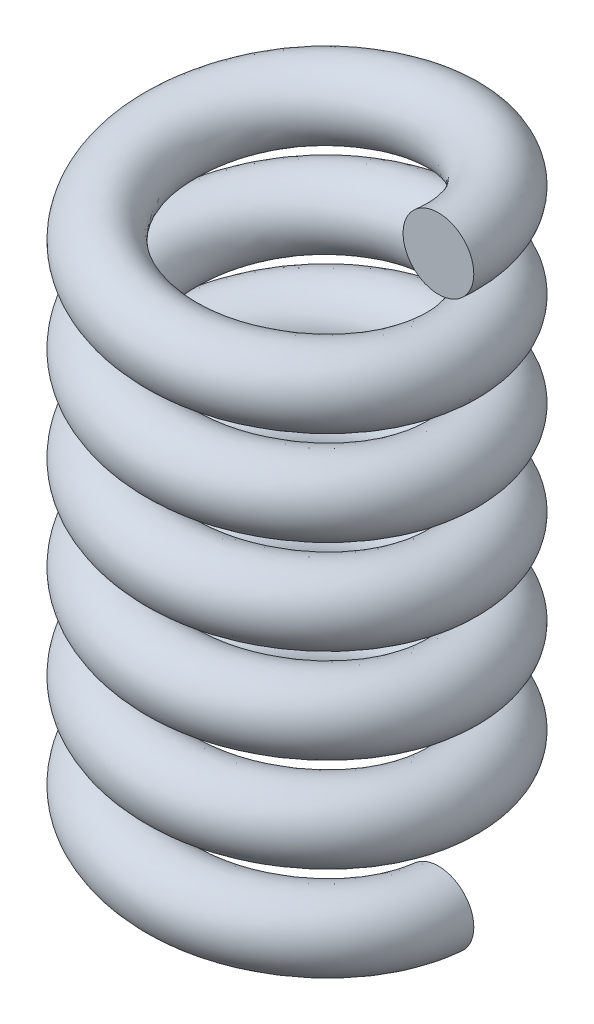
ISO-10303-21;
HEADER;
FILE_DESCRIPTION(('STEP AP214'),'2;1');
FILE_NAME('part.step','',(''),(''),'','','');
FILE_SCHEMA(('AUTOMOTIVE_DESIGN { 1 0 10303 214 1 1 1 1 }'));
ENDSEC;
DATA;
#1=APPLICATION_CONTEXT('core data for automotive mechanical design processes');
#2=APPLICATION_PROTOCOL_DEFINITION('international standard','automotive_design',2000,#1);
#3=PRODUCT_CONTEXT('',#1,'mechanical');
#4=PRODUCT('Part','Part','',(#3));
#5=PRODUCT_RELATED_PRODUCT_CATEGORY('part','',(#4));
#6=PRODUCT_DEFINITION_FORMATION('','',#4);
#7=PRODUCT_DEFINITION_CONTEXT('part definition',#1,'design');
#8=PRODUCT_DEFINITION('design','',#6,#7);
#9=PRODUCT_DEFINITION_SHAPE('','',#8);
#10=(LENGTH_UNIT() NAMED_UNIT(*) SI_UNIT(.MILLI.,.METRE.));
#11=(NAMED_UNIT(*) PLANE_ANGLE_UNIT() SI_UNIT($,.RADIAN.));
#12=(NAMED_UNIT(*) SI_UNIT($,.STERADIAN.) SOLID_ANGLE_UNIT());
#13=UNCERTAINTY_MEASURE_WITH_UNIT(LENGTH_MEASURE(1.E-05),#10,'distance_accuracy_value','');
#14=(GEOMETRIC_REPRESENTATION_CONTEXT(3) GLOBAL_UNCERTAINTY_ASSIGNED_CONTEXT((#13)) GLOBAL_UNIT_ASSIGNED_CONTEXT((#10,
#11,#12)) REPRESENTATION_CONTEXT('',''));
#15=CARTESIAN_POINT('',(0.,0.,0.));
#16=DIRECTION('',(0.,0.,1.));
#17=DIRECTION('',(1.,0.,0.));
#18=AXIS2_PLACEMENT_3D('',#15,#16,#17);
#19=CARTESIAN_POINT('',(10.,0.,8.37955521322352E-13));
#20=DIRECTION('',(0.,0.,1.));
#21=DIRECTION('',(1.,0.,0.));
#22=AXIS2_PLACEMENT_3D('',#19,#20,#21);
#23=PLANE('',#22);
#24=CARTESIAN_POINT('',(10.,0.,8.37955521322352E-13));
#25=DIRECTION('',(0.,0.,1.));
#26=DIRECTION('',(1.,0.,0.));
#27=AXIS2_PLACEMENT_3D('',#24,#25,#26);
#28=CIRCLE('',#27,2.5);
#29=CARTESIAN_POINT('',(12.5,0.,1.04744440165294E-12));
#30=VERTEX_POINT('',#29);
#31=EDGE_CURVE('E45',#30,#30,#28,.T.);
#32=ORIENTED_EDGE('',*,*,#31,.T.);
#33=EDGE_LOOP('',(#32));
#34=FACE_BOUND('',#33,.T.);
#35=ADVANCED_FACE('F39',(#34),#23,.T.);
#36=CARTESIAN_POINT('',(10.,-40.,0.));
#37=DIRECTION('',(0.,0.,1.));
#38=DIRECTION('',(1.,0.,0.));
#39=AXIS2_PLACEMENT_3D('',#36,#37,#38);
#40=PLANE('',#39);
#41=CARTESIAN_POINT('',(10.,-40.,0.));
#42=DIRECTION('',(0.,0.,1.));
#43=DIRECTION('',(1.,0.,0.));
#44=AXIS2_PLACEMENT_3D('',#41,#42,#43);
#45=CIRCLE('',#44,2.5);
#46=CARTESIAN_POINT('',(12.5,-40.,0.));
#47=VERTEX_POINT('',#46);
#48=EDGE_CURVE('E10',#47,#47,#45,.T.);
#49=ORIENTED_EDGE('',*,*,#48,.F.);
#50=EDGE_LOOP('',(#49));
#51=FACE_BOUND('',#50,.T.);
#52=ADVANCED_FACE('F54',(#51),#40,.F.);
#53=CARTESIAN_POINT('',(12.5,0.,1.04744440165294E-12));
#54=CARTESIAN_POINT('',(12.5000000000006,-0.555555555555554,-7.21687836486927));
#55=CARTESIAN_POINT('',(6.25000000000091,-1.11111111111111,-10.825317547305));
#56=CARTESIAN_POINT('',(1.21057253500978E-12,-1.66666666666666,-14.4337567297406));
#57=CARTESIAN_POINT('',(-6.24999999999909,-2.22222222222222,-10.825317547306));
#58=CARTESIAN_POINT('',(-12.4999999999994,-2.77777777777778,-7.21687836487137));
#59=CARTESIAN_POINT('',(-12.5,-3.33333333333333,-1.04897521015187E-12));
#60=CARTESIAN_POINT('',(-12.5000000000006,-3.88888888888888,7.21687836486927));
#61=CARTESIAN_POINT('',(-6.25000000000091,-4.44444444444444,10.825317547305));
#62=CARTESIAN_POINT('',(-1.21152372920822E-12,-4.99999999999999,14.4337567297406));
#63=CARTESIAN_POINT('',(6.24999999999909,-5.55555555555554,10.825317547306));
#64=CARTESIAN_POINT('',(12.4999999999994,-6.1111111111111,7.21687836487138));
#65=CARTESIAN_POINT('',(12.5,-6.66666666666665,1.04744440165294E-12));
#66=CARTESIAN_POINT('',(12.5000000000006,-7.22222222222221,-7.21687836486927));
#67=CARTESIAN_POINT('',(6.25000000000091,-7.77777777777776,-10.825317547305));
#68=CARTESIAN_POINT('',(1.21138896620921E-12,-8.33333333333332,-14.4337567297406));
#69=CARTESIAN_POINT('',(-6.24999999999909,-8.88888888888887,-10.825317547306));
#70=CARTESIAN_POINT('',(-12.4999999999994,-9.44444444444443,-7.21687836487137));
#71=CARTESIAN_POINT('',(-12.5,-9.99999999999998,-1.04897521015187E-12));
#72=CARTESIAN_POINT('',(-12.5000000000006,-10.5555555555555,7.21687836486927));
#73=CARTESIAN_POINT('',(-6.25000000000091,-11.1111111111111,10.825317547305));
#74=CARTESIAN_POINT('',(-1.21070729800879E-12,-11.6666666666666,14.4337567297406));
#75=CARTESIAN_POINT('',(6.24999999999909,-12.2222222222222,10.825317547306));
#76=CARTESIAN_POINT('',(12.4999999999994,-12.7777777777777,7.21687836487138));
#77=CARTESIAN_POINT('',(12.5,-13.3333333333333,1.04744440165294E-12));
#78=CARTESIAN_POINT('',(12.5000000000006,-13.8888888888889,-7.21687836486927));
#79=CARTESIAN_POINT('',(6.25000000000091,-14.4444444444444,-10.825317547305));
#80=CARTESIAN_POINT('',(1.21220539740864E-12,-15.,-14.4337567297406));
#81=CARTESIAN_POINT('',(-6.24999999999909,-15.5555555555555,-10.825317547306));
#82=CARTESIAN_POINT('',(-12.4999999999994,-16.1111111111111,-7.21687836487137));
#83=CARTESIAN_POINT('',(-12.5,-16.6666666666666,-1.04897521015187E-12));
#84=CARTESIAN_POINT('',(-12.5000000000006,-17.2222222222222,7.21687836486927));
#85=CARTESIAN_POINT('',(-6.25000000000091,-17.7777777777777,10.825317547305));
#86=CARTESIAN_POINT('',(-1.20989086680936E-12,-18.3333333333333,14.4337567297406));
#87=CARTESIAN_POINT('',(6.24999999999909,-18.8888888888888,10.825317547306));
#88=CARTESIAN_POINT('',(12.4999999999994,-19.4444444444444,7.21687836487138));
#89=CARTESIAN_POINT('',(12.5,-20.,1.04744440165294E-12));
#90=CARTESIAN_POINT('',(12.5000000000006,-20.5555555555555,-7.21687836486927));
#91=CARTESIAN_POINT('',(6.25000000000091,-21.1111111111111,-10.825317547305));
#92=CARTESIAN_POINT('',(1.21302182860807E-12,-21.6666666666666,-14.4337567297406));
#93=CARTESIAN_POINT('',(-6.24999999999909,-22.2222222222222,-10.825317547306));
#94=CARTESIAN_POINT('',(-12.4999999999994,-22.7777777777777,-7.21687836487137));
#95=CARTESIAN_POINT('',(-12.5,-23.3333333333333,-1.04897521015187E-12));
#96=CARTESIAN_POINT('',(-12.5000000000006,-23.8888888888888,7.21687836486927));
#97=CARTESIAN_POINT('',(-6.25000000000091,-24.4444444444444,10.825317547305));
#98=CARTESIAN_POINT('',(-1.20907443560993E-12,-24.9999999999999,14.4337567297406));
#99=CARTESIAN_POINT('',(6.24999999999909,-25.5555555555555,10.825317547306));
#100=CARTESIAN_POINT('',(12.4999999999994,-26.1111111111111,7.21687836487138));
#101=CARTESIAN_POINT('',(12.5,-26.6666666666666,1.04744440165294E-12));
#102=CARTESIAN_POINT('',(12.5000000000006,-27.2222222222222,-7.21687836486927));
#103=CARTESIAN_POINT('',(6.25000000000091,-27.7777777777777,-10.825317547305));
#104=CARTESIAN_POINT('',(1.2138382598075E-12,-28.3333333333333,-14.4337567297406));
#105=CARTESIAN_POINT('',(-6.24999999999909,-28.8888888888888,-10.825317547306));
#106=CARTESIAN_POINT('',(-12.4999999999994,-29.4444444444444,-7.21687836487137));
#107=CARTESIAN_POINT('',(-12.5,-29.9999999999999,-1.04897521015187E-12));
#108=CARTESIAN_POINT('',(-12.5000000000006,-30.5555555555555,7.21687836486927));
#109=CARTESIAN_POINT('',(-6.25000000000091,-31.111111111111,10.825317547305));
#110=CARTESIAN_POINT('',(-1.2082580044105E-12,-31.6666666666666,14.4337567297406));
#111=CARTESIAN_POINT('',(6.24999999999909,-32.2222222222222,10.825317547306));
#112=CARTESIAN_POINT('',(12.4999999999994,-32.7777777777777,7.21687836487138));
#113=CARTESIAN_POINT('',(12.5,-33.3333333333333,1.04744440165294E-12));
#114=CARTESIAN_POINT('',(12.5000000000006,-33.8888888888888,-7.21687836486927));
#115=CARTESIAN_POINT('',(6.25000000000091,-34.4444444444444,-10.825317547305));
#116=CARTESIAN_POINT('',(1.21465469100694E-12,-34.9999999999999,-14.4337567297406));
#117=CARTESIAN_POINT('',(-6.24999999999909,-35.5555555555555,-10.825317547306));
#118=CARTESIAN_POINT('',(-12.4999999999994,-36.111111111111,-7.21687836487137));
#119=CARTESIAN_POINT('',(-12.5,-36.6666666666666,-1.04897521015187E-12));
#120=CARTESIAN_POINT('',(-12.5000000000006,-37.2222222222221,7.21687836486927));
#121=CARTESIAN_POINT('',(-6.25000000000091,-37.7777777777777,10.825317547305));
#122=CARTESIAN_POINT('',(-1.20744157321106E-12,-38.3333333333333,14.4337567297406));
#123=CARTESIAN_POINT('',(6.24999999999909,-38.8888888888888,10.825317547306));
#124=CARTESIAN_POINT('',(12.4999999999994,-39.4444444444444,7.21687836487138));
#125=CARTESIAN_POINT('',(12.5,-39.9999999999999,1.04744440165294E-12));
#126=CARTESIAN_POINT('',(12.5,5.,1.04744440165294E-12));
#127=CARTESIAN_POINT('',(12.5000000000006,4.44444444444445,-7.21687836486927));
#128=CARTESIAN_POINT('',(6.25000000000091,3.88888888888889,-10.825317547305));
#129=CARTESIAN_POINT('',(1.2099602116102E-12,3.33333333333334,-14.4337567297406));
#130=CARTESIAN_POINT('',(-6.24999999999909,2.77777777777778,-10.825317547306));
#131=CARTESIAN_POINT('',(-12.4999999999994,2.22222222222223,-7.21687836487137));
#132=CARTESIAN_POINT('',(-12.5,1.66666666666667,-1.04897521015187E-12));
#133=CARTESIAN_POINT('',(-12.5000000000006,1.11111111111112,7.21687836486927));
#134=CARTESIAN_POINT('',(-6.25000000000091,0.555555555555563,10.825317547305));
#135=CARTESIAN_POINT('',(-1.2121360526078E-12,0.,14.4337567297406));
#136=CARTESIAN_POINT('',(6.24999999999908,-0.555555555555543,10.825317547306));
#137=CARTESIAN_POINT('',(12.4999999999994,-1.1111111111111,7.21687836487138));
#138=CARTESIAN_POINT('',(12.5,-1.66666666666665,1.04744440165294E-12));
#139=CARTESIAN_POINT('',(12.5000000000006,-2.22222222222221,-7.21687836486927));
#140=CARTESIAN_POINT('',(6.25000000000091,-2.77777777777776,-10.825317547305));
#141=CARTESIAN_POINT('',(1.21077664280964E-12,-3.33333333333332,-14.4337567297406));
#142=CARTESIAN_POINT('',(-6.24999999999909,-3.88888888888887,-10.825317547306));
#143=CARTESIAN_POINT('',(-12.4999999999994,-4.44444444444443,-7.21687836487137));
#144=CARTESIAN_POINT('',(-12.5,-4.99999999999998,-1.04897521015187E-12));
#145=CARTESIAN_POINT('',(-12.5000000000006,-5.55555555555554,7.21687836486927));
#146=CARTESIAN_POINT('',(-6.25000000000091,-6.11111111111109,10.825317547305));
#147=CARTESIAN_POINT('',(-1.21131962140836E-12,-6.66666666666664,14.4337567297406));
#148=CARTESIAN_POINT('',(6.24999999999909,-7.2222222222222,10.825317547306));
#149=CARTESIAN_POINT('',(12.4999999999994,-7.77777777777775,7.21687836487138));
#150=CARTESIAN_POINT('',(12.5,-8.3333333333333,1.04744440165294E-12));
#151=CARTESIAN_POINT('',(12.5000000000006,-8.88888888888886,-7.21687836486927));
#152=CARTESIAN_POINT('',(6.25000000000091,-9.44444444444441,-10.825317547305));
#153=CARTESIAN_POINT('',(1.21159307400907E-12,-9.99999999999997,-14.4337567297406));
#154=CARTESIAN_POINT('',(-6.24999999999909,-10.5555555555555,-10.825317547306));
#155=CARTESIAN_POINT('',(-12.4999999999994,-11.1111111111111,-7.21687836487137));
#156=CARTESIAN_POINT('',(-12.5,-11.6666666666666,-1.04897521015187E-12));
#157=CARTESIAN_POINT('',(-12.5000000000006,-12.2222222222222,7.21687836486927));
#158=CARTESIAN_POINT('',(-6.25000000000091,-12.7777777777777,10.825317547305));
#159=CARTESIAN_POINT('',(-1.21050319020893E-12,-13.3333333333333,14.4337567297406));
#160=CARTESIAN_POINT('',(6.24999999999909,-13.8888888888888,10.825317547306));
#161=CARTESIAN_POINT('',(12.4999999999994,-14.4444444444444,7.21687836487138));
#162=CARTESIAN_POINT('',(12.5,-15.,1.04744440165294E-12));
#163=CARTESIAN_POINT('',(12.5000000000006,-15.5555555555555,-7.21687836486927));
#164=CARTESIAN_POINT('',(6.25000000000091,-16.1111111111111,-10.825317547305));
#165=CARTESIAN_POINT('',(1.2124095052085E-12,-16.6666666666666,-14.4337567297406));
#166=CARTESIAN_POINT('',(-6.24999999999909,-17.2222222222222,-10.825317547306));
#167=CARTESIAN_POINT('',(-12.4999999999994,-17.7777777777777,-7.21687836487137));
#168=CARTESIAN_POINT('',(-12.5,-18.3333333333333,-1.04897521015187E-12));
#169=CARTESIAN_POINT('',(-12.5000000000006,-18.8888888888888,7.21687836486927));
#170=CARTESIAN_POINT('',(-6.25000000000091,-19.4444444444444,10.825317547305));
#171=CARTESIAN_POINT('',(-1.2096867590095E-12,-20.,14.4337567297406));
#172=CARTESIAN_POINT('',(6.24999999999909,-20.5555555555555,10.825317547306));
#173=CARTESIAN_POINT('',(12.4999999999994,-21.1111111111111,7.21687836487138));
#174=CARTESIAN_POINT('',(12.5,-21.6666666666666,1.04744440165294E-12));
#175=CARTESIAN_POINT('',(12.5000000000006,-22.2222222222222,-7.21687836486927));
#176=CARTESIAN_POINT('',(6.25000000000091,-22.7777777777777,-10.825317547305));
#177=CARTESIAN_POINT('',(1.21322593640793E-12,-23.3333333333333,-14.4337567297406));
#178=CARTESIAN_POINT('',(-6.24999999999909,-23.8888888888888,-10.825317547306));
#179=CARTESIAN_POINT('',(-12.4999999999994,-24.4444444444444,-7.21687836487137));
#180=CARTESIAN_POINT('',(-12.5,-24.9999999999999,-1.04897521015187E-12));
#181=CARTESIAN_POINT('',(-12.5000000000006,-25.5555555555555,7.21687836486927));
#182=CARTESIAN_POINT('',(-6.25000000000091,-26.1111111111111,10.825317547305));
#183=CARTESIAN_POINT('',(-1.20887032781007E-12,-26.6666666666666,14.4337567297406));
#184=CARTESIAN_POINT('',(6.24999999999909,-27.2222222222222,10.825317547306));
#185=CARTESIAN_POINT('',(12.4999999999994,-27.7777777777777,7.21687836487138));
#186=CARTESIAN_POINT('',(12.5,-28.3333333333333,1.04744440165294E-12));
#187=CARTESIAN_POINT('',(12.5000000000006,-28.8888888888888,-7.21687836486927));
#188=CARTESIAN_POINT('',(6.25000000000091,-29.4444444444444,-10.825317547305));
#189=CARTESIAN_POINT('',(1.21404236760736E-12,-29.9999999999999,-14.4337567297406));
#190=CARTESIAN_POINT('',(-6.24999999999909,-30.5555555555555,-10.825317547306));
#191=CARTESIAN_POINT('',(-12.4999999999994,-31.111111111111,-7.21687836487137));
#192=CARTESIAN_POINT('',(-12.5,-31.6666666666666,-1.04897521015187E-12));
#193=CARTESIAN_POINT('',(-12.5000000000006,-32.2222222222221,7.21687836486927));
#194=CARTESIAN_POINT('',(-6.25000000000091,-32.7777777777777,10.825317547305));
#195=CARTESIAN_POINT('',(-1.20805389661064E-12,-33.3333333333333,14.4337567297406));
#196=CARTESIAN_POINT('',(6.24999999999909,-33.8888888888888,10.825317547306));
#197=CARTESIAN_POINT('',(12.4999999999994,-34.4444444444444,7.21687836487138));
#198=CARTESIAN_POINT('',(12.5,-34.9999999999999,1.04744440165294E-12));
#199=CARTESIAN_POINT('',(7.5,5.,6.28466640991764E-13));
#200=CARTESIAN_POINT('',(7.50000000000036,4.44444444444445,-4.33012701892156));
#201=CARTESIAN_POINT('',(3.75000000000055,3.88888888888889,-6.49519052838298));
#202=CARTESIAN_POINT('',(7.25812840726236E-13,3.33333333333334,-8.66025403784439));
#203=CARTESIAN_POINT('',(-3.74999999999945,2.77777777777778,-6.49519052838361));
#204=CARTESIAN_POINT('',(-7.49999999999964,2.22222222222223,-4.33012701892283));
#205=CARTESIAN_POINT('',(-7.5,1.66666666666667,-6.29385126091125E-13));
#206=CARTESIAN_POINT('',(-7.50000000000037,1.11111111111112,4.33012701892156));
#207=CARTESIAN_POINT('',(-3.75000000000055,0.555555555555564,6.49519052838298));
#208=CARTESIAN_POINT('',(-7.27281631564677E-13,0.,8.66025403784439));
#209=CARTESIAN_POINT('',(3.74999999999945,-0.555555555555543,6.49519052838361));
#210=CARTESIAN_POINT('',(7.49999999999964,-1.1111111111111,4.33012701892283));
#211=CARTESIAN_POINT('',(7.5,-1.66666666666665,6.28466640991764E-13));
#212=CARTESIAN_POINT('',(7.50000000000036,-2.22222222222221,-4.33012701892156));
#213=CARTESIAN_POINT('',(3.75000000000055,-2.77777777777776,-6.49519052838298));
#214=CARTESIAN_POINT('',(7.26629271925668E-13,-3.33333333333332,-8.66025403784439));
#215=CARTESIAN_POINT('',(-3.74999999999945,-3.88888888888887,-6.49519052838361));
#216=CARTESIAN_POINT('',(-7.49999999999964,-4.44444444444442,-4.33012701892283));
#217=CARTESIAN_POINT('',(-7.5,-4.99999999999998,-6.29385126091125E-13));
#218=CARTESIAN_POINT('',(-7.50000000000037,-5.55555555555553,4.33012701892156));
#219=CARTESIAN_POINT('',(-3.75000000000055,-6.11111111111109,6.49519052838298));
#220=CARTESIAN_POINT('',(-7.26465200365246E-13,-6.66666666666664,8.66025403784439));
#221=CARTESIAN_POINT('',(3.74999999999945,-7.2222222222222,6.49519052838361));
#222=CARTESIAN_POINT('',(7.49999999999964,-7.77777777777775,4.33012701892283));
#223=CARTESIAN_POINT('',(7.5,-8.3333333333333,6.28466640991764E-13));
#224=CARTESIAN_POINT('',(7.50000000000037,-8.88888888888886,-4.33012701892156));
#225=CARTESIAN_POINT('',(3.75000000000055,-9.44444444444441,-6.49519052838298));
#226=CARTESIAN_POINT('',(7.27445703125099E-13,-9.99999999999997,-8.66025403784439));
#227=CARTESIAN_POINT('',(-3.74999999999945,-10.5555555555555,-6.49519052838361));
#228=CARTESIAN_POINT('',(-7.49999999999964,-11.1111111111111,-4.33012701892283));
#229=CARTESIAN_POINT('',(-7.5,-11.6666666666666,-6.29385126091125E-13));
#230=CARTESIAN_POINT('',(-7.50000000000037,-12.2222222222222,4.33012701892156));
#231=CARTESIAN_POINT('',(-3.75000000000055,-12.7777777777777,6.49519052838298));
#232=CARTESIAN_POINT('',(-7.25648769165814E-13,-13.3333333333333,8.66025403784439));
#233=CARTESIAN_POINT('',(3.74999999999945,-13.8888888888888,6.49519052838361));
#234=CARTESIAN_POINT('',(7.49999999999964,-14.4444444444444,4.33012701892283));
#235=CARTESIAN_POINT('',(7.5,-15.,6.28466640991764E-13));
#236=CARTESIAN_POINT('',(7.50000000000037,-15.5555555555555,-4.33012701892156));
#237=CARTESIAN_POINT('',(3.75000000000055,-16.1111111111111,-6.49519052838298));
#238=CARTESIAN_POINT('',(7.28262134324531E-13,-16.6666666666666,-8.66025403784439));
#239=CARTESIAN_POINT('',(-3.74999999999945,-17.2222222222222,-6.49519052838361));
#240=CARTESIAN_POINT('',(-7.49999999999964,-17.7777777777777,-4.33012701892283));
#241=CARTESIAN_POINT('',(-7.5,-18.3333333333333,-6.29385126091125E-13));
#242=CARTESIAN_POINT('',(-7.50000000000036,-18.8888888888888,4.33012701892156));
#243=CARTESIAN_POINT('',(-3.75000000000055,-19.4444444444444,6.49519052838298));
#244=CARTESIAN_POINT('',(-7.24832337966382E-13,-19.9999999999999,8.66025403784439));
#245=CARTESIAN_POINT('',(3.74999999999945,-20.5555555555555,6.49519052838361));
#246=CARTESIAN_POINT('',(7.49999999999964,-21.1111111111111,4.33012701892283));
#247=CARTESIAN_POINT('',(7.50000000000001,-21.6666666666666,6.28466640991764E-13));
#248=CARTESIAN_POINT('',(7.50000000000037,-22.2222222222222,-4.33012701892156));
#249=CARTESIAN_POINT('',(3.75000000000055,-22.7777777777777,-6.49519052838298));
#250=CARTESIAN_POINT('',(7.29078565523963E-13,-23.3333333333333,-8.66025403784439));
#251=CARTESIAN_POINT('',(-3.74999999999945,-23.8888888888888,-6.49519052838361));
#252=CARTESIAN_POINT('',(-7.49999999999964,-24.4444444444444,-4.33012701892283));
#253=CARTESIAN_POINT('',(-7.5,-24.9999999999999,-6.29385126091125E-13));
#254=CARTESIAN_POINT('',(-7.50000000000036,-25.5555555555555,4.33012701892156));
#255=CARTESIAN_POINT('',(-3.75000000000054,-26.111111111111,6.49519052838298));
#256=CARTESIAN_POINT('',(-7.24015906766951E-13,-26.6666666666666,8.66025403784439));
#257=CARTESIAN_POINT('',(3.74999999999945,-27.2222222222222,6.49519052838361));
#258=CARTESIAN_POINT('',(7.49999999999964,-27.7777777777777,4.33012701892283));
#259=CARTESIAN_POINT('',(7.50000000000001,-28.3333333333333,6.28466640991764E-13));
#260=CARTESIAN_POINT('',(7.50000000000037,-28.8888888888888,-4.33012701892156));
#261=CARTESIAN_POINT('',(3.75000000000055,-29.4444444444444,-6.49519052838298));
#262=CARTESIAN_POINT('',(7.29894996723394E-13,-29.9999999999999,-8.66025403784439));
#263=CARTESIAN_POINT('',(-3.74999999999945,-30.5555555555555,-6.49519052838361));
#264=CARTESIAN_POINT('',(-7.49999999999963,-31.111111111111,-4.33012701892283));
#265=CARTESIAN_POINT('',(-7.5,-31.6666666666666,-6.29385126091125E-13));
#266=CARTESIAN_POINT('',(-7.50000000000036,-32.2222222222221,4.33012701892156));
#267=CARTESIAN_POINT('',(-3.75000000000054,-32.7777777777777,6.49519052838298));
#268=CARTESIAN_POINT('',(-7.23199475567519E-13,-33.3333333333333,8.66025403784439));
#269=CARTESIAN_POINT('',(3.74999999999946,-33.8888888888888,6.49519052838361));
#270=CARTESIAN_POINT('',(7.49999999999964,-34.4444444444444,4.33012701892283));
#271=CARTESIAN_POINT('',(7.50000000000001,-34.9999999999999,6.28466640991764E-13));
#272=CARTESIAN_POINT('',(7.5,0.,6.28466640991764E-13));
#273=CARTESIAN_POINT('',(7.50000000000036,-0.555555555555554,-4.33012701892156));
#274=CARTESIAN_POINT('',(3.75000000000054,-1.11111111111111,-6.49519052838297));
#275=CARTESIAN_POINT('',(7.2642516412581E-13,-1.66666666666666,-8.66025403784439));
#276=CARTESIAN_POINT('',(-3.74999999999945,-2.22222222222222,-6.4951905283836));
#277=CARTESIAN_POINT('',(-7.49999999999963,-2.77777777777777,-4.33012701892282));
#278=CARTESIAN_POINT('',(-7.5,-3.33333333333333,-6.29385126091124E-13));
#279=CARTESIAN_POINT('',(-7.50000000000036,-3.88888888888888,4.33012701892156));
#280=CARTESIAN_POINT('',(-3.75000000000055,-4.44444444444444,6.49519052838297));
#281=CARTESIAN_POINT('',(-7.26669308165103E-13,-4.99999999999999,8.66025403784439));
#282=CARTESIAN_POINT('',(3.74999999999945,-5.55555555555554,6.49519052838361));
#283=CARTESIAN_POINT('',(7.49999999999963,-6.1111111111111,4.33012701892283));
#284=CARTESIAN_POINT('',(7.5,-6.66666666666665,6.28466640991764E-13));
#285=CARTESIAN_POINT('',(7.50000000000036,-7.22222222222221,-4.33012701892156));
#286=CARTESIAN_POINT('',(3.75000000000055,-7.77777777777776,-6.49519052838297));
#287=CARTESIAN_POINT('',(7.27241595325242E-13,-8.33333333333332,-8.66025403784439));
#288=CARTESIAN_POINT('',(-3.74999999999945,-8.88888888888887,-6.4951905283836));
#289=CARTESIAN_POINT('',(-7.49999999999963,-9.44444444444443,-4.33012701892282));
#290=CARTESIAN_POINT('',(-7.5,-9.99999999999998,-6.29385126091124E-13));
#291=CARTESIAN_POINT('',(-7.50000000000036,-10.5555555555555,4.33012701892156));
#292=CARTESIAN_POINT('',(-3.75000000000055,-11.1111111111111,6.49519052838297));
#293=CARTESIAN_POINT('',(-7.25852876965672E-13,-11.6666666666666,8.66025403784439));
#294=CARTESIAN_POINT('',(3.74999999999945,-12.2222222222222,6.49519052838361));
#295=CARTESIAN_POINT('',(7.49999999999964,-12.7777777777777,4.33012701892283));
#296=CARTESIAN_POINT('',(7.5,-13.3333333333333,6.28466640991764E-13));
#297=CARTESIAN_POINT('',(7.50000000000036,-13.8888888888889,-4.33012701892156));
#298=CARTESIAN_POINT('',(3.75000000000055,-14.4444444444444,-6.49519052838297));
#299=CARTESIAN_POINT('',(7.28058026524673E-13,-15.,-8.66025403784439));
#300=CARTESIAN_POINT('',(-3.74999999999945,-15.5555555555555,-6.4951905283836));
#301=CARTESIAN_POINT('',(-7.49999999999963,-16.1111111111111,-4.33012701892282));
#302=CARTESIAN_POINT('',(-7.5,-16.6666666666666,-6.29385126091124E-13));
#303=CARTESIAN_POINT('',(-7.50000000000036,-17.2222222222222,4.33012701892156));
#304=CARTESIAN_POINT('',(-3.75000000000055,-17.7777777777777,6.49519052838297));
#305=CARTESIAN_POINT('',(-7.2503644576624E-13,-18.3333333333333,8.66025403784439));
#306=CARTESIAN_POINT('',(3.74999999999945,-18.8888888888888,6.49519052838361));
#307=CARTESIAN_POINT('',(7.49999999999964,-19.4444444444444,4.33012701892283));
#308=CARTESIAN_POINT('',(7.5,-20.,6.28466640991764E-13));
#309=CARTESIAN_POINT('',(7.50000000000037,-20.5555555555555,-4.33012701892156));
#310=CARTESIAN_POINT('',(3.75000000000055,-21.1111111111111,-6.49519052838297));
#311=CARTESIAN_POINT('',(7.28874457724105E-13,-21.6666666666666,-8.66025403784439));
#312=CARTESIAN_POINT('',(-3.74999999999945,-22.2222222222222,-6.4951905283836));
#313=CARTESIAN_POINT('',(-7.49999999999963,-22.7777777777777,-4.33012701892282));
#314=CARTESIAN_POINT('',(-7.5,-23.3333333333333,-6.29385126091124E-13));
#315=CARTESIAN_POINT('',(-7.50000000000036,-23.8888888888888,4.33012701892156));
#316=CARTESIAN_POINT('',(-3.75000000000054,-24.4444444444444,6.49519052838297));
#317=CARTESIAN_POINT('',(-7.24220014566809E-13,-24.9999999999999,8.66025403784439));
#318=CARTESIAN_POINT('',(3.74999999999945,-25.5555555555555,6.49519052838361));
#319=CARTESIAN_POINT('',(7.49999999999964,-26.1111111111111,4.33012701892283));
#320=CARTESIAN_POINT('',(7.5,-26.6666666666666,6.28466640991764E-13));
#321=CARTESIAN_POINT('',(7.50000000000037,-27.2222222222222,-4.33012701892156));
#322=CARTESIAN_POINT('',(3.75000000000055,-27.7777777777777,-6.49519052838297));
#323=CARTESIAN_POINT('',(7.29690888923536E-13,-28.3333333333333,-8.66025403784439));
#324=CARTESIAN_POINT('',(-3.74999999999945,-28.8888888888888,-6.4951905283836));
#325=CARTESIAN_POINT('',(-7.49999999999963,-29.4444444444444,-4.33012701892282));
#326=CARTESIAN_POINT('',(-7.5,-29.9999999999999,-6.29385126091124E-13));
#327=CARTESIAN_POINT('',(-7.50000000000036,-30.5555555555555,4.33012701892156));
#328=CARTESIAN_POINT('',(-3.75000000000054,-31.111111111111,6.49519052838297));
#329=CARTESIAN_POINT('',(-7.23403583367377E-13,-31.6666666666666,8.66025403784439));
#330=CARTESIAN_POINT('',(3.74999999999945,-32.2222222222222,6.49519052838361));
#331=CARTESIAN_POINT('',(7.49999999999964,-32.7777777777777,4.33012701892283));
#332=CARTESIAN_POINT('',(7.5,-33.3333333333333,6.28466640991764E-13));
#333=CARTESIAN_POINT('',(7.50000000000037,-33.8888888888888,-4.33012701892156));
#334=CARTESIAN_POINT('',(3.75000000000055,-34.4444444444444,-6.49519052838297));
#335=CARTESIAN_POINT('',(7.30507320122968E-13,-34.9999999999999,-8.66025403784439));
#336=CARTESIAN_POINT('',(-3.74999999999945,-35.5555555555555,-6.4951905283836));
#337=CARTESIAN_POINT('',(-7.49999999999963,-36.111111111111,-4.33012701892282));
#338=CARTESIAN_POINT('',(-7.5,-36.6666666666666,-6.29385126091124E-13));
#339=CARTESIAN_POINT('',(-7.50000000000036,-37.2222222222221,4.33012701892156));
#340=CARTESIAN_POINT('',(-3.75000000000054,-37.7777777777777,6.49519052838297));
#341=CARTESIAN_POINT('',(-7.22587152167945E-13,-38.3333333333333,8.66025403784439));
#342=CARTESIAN_POINT('',(3.74999999999946,-38.8888888888888,6.49519052838361));
#343=CARTESIAN_POINT('',(7.49999999999964,-39.4444444444444,4.33012701892283));
#344=CARTESIAN_POINT('',(7.50000000000001,-39.9999999999999,6.28466640991764E-13));
#345=CARTESIAN_POINT('',(7.5,-5.,6.28466640991764E-13));
#346=CARTESIAN_POINT('',(7.50000000000036,-5.55555555555555,-4.33012701892156));
#347=CARTESIAN_POINT('',(3.75000000000054,-6.11111111111111,-6.49519052838297));
#348=CARTESIAN_POINT('',(7.27037487525384E-13,-6.66666666666666,-8.66025403784439));
#349=CARTESIAN_POINT('',(-3.74999999999945,-7.22222222222222,-6.4951905283836));
#350=CARTESIAN_POINT('',(-7.49999999999963,-7.77777777777777,-4.33012701892283));
#351=CARTESIAN_POINT('',(-7.5,-8.33333333333333,-6.29385126091124E-13));
#352=CARTESIAN_POINT('',(-7.50000000000036,-8.88888888888888,4.33012701892156));
#353=CARTESIAN_POINT('',(-3.75000000000055,-9.44444444444444,6.49519052838297));
#354=CARTESIAN_POINT('',(-7.2605698476553E-13,-9.99999999999999,8.66025403784439));
#355=CARTESIAN_POINT('',(3.74999999999945,-10.5555555555555,6.49519052838361));
#356=CARTESIAN_POINT('',(7.49999999999964,-11.1111111111111,4.33012701892283));
#357=CARTESIAN_POINT('',(7.5,-11.6666666666667,6.28466640991764E-13));
#358=CARTESIAN_POINT('',(7.50000000000036,-12.2222222222222,-4.33012701892156));
#359=CARTESIAN_POINT('',(3.75000000000055,-12.7777777777778,-6.49519052838297));
#360=CARTESIAN_POINT('',(7.27853918724815E-13,-13.3333333333333,-8.66025403784439));
#361=CARTESIAN_POINT('',(-3.74999999999945,-13.8888888888889,-6.4951905283836));
#362=CARTESIAN_POINT('',(-7.49999999999963,-14.4444444444444,-4.33012701892283));
#363=CARTESIAN_POINT('',(-7.5,-15.,-6.29385126091124E-13));
#364=CARTESIAN_POINT('',(-7.50000000000036,-15.5555555555555,4.33012701892156));
#365=CARTESIAN_POINT('',(-3.75000000000055,-16.1111111111111,6.49519052838297));
#366=CARTESIAN_POINT('',(-7.25240553566098E-13,-16.6666666666666,8.66025403784439));
#367=CARTESIAN_POINT('',(3.74999999999945,-17.2222222222222,6.49519052838361));
#368=CARTESIAN_POINT('',(7.49999999999964,-17.7777777777778,4.33012701892283));
#369=CARTESIAN_POINT('',(7.5,-18.3333333333333,6.28466640991764E-13));
#370=CARTESIAN_POINT('',(7.50000000000036,-18.8888888888889,-4.33012701892156));
#371=CARTESIAN_POINT('',(3.75000000000055,-19.4444444444444,-6.49519052838297));
#372=CARTESIAN_POINT('',(7.28670349924247E-13,-20.,-8.66025403784439));
#373=CARTESIAN_POINT('',(-3.74999999999945,-20.5555555555555,-6.4951905283836));
#374=CARTESIAN_POINT('',(-7.49999999999963,-21.1111111111111,-4.33012701892283));
#375=CARTESIAN_POINT('',(-7.5,-21.6666666666666,-6.29385126091124E-13));
#376=CARTESIAN_POINT('',(-7.50000000000036,-22.2222222222222,4.33012701892156));
#377=CARTESIAN_POINT('',(-3.75000000000054,-22.7777777777777,6.49519052838297));
#378=CARTESIAN_POINT('',(-7.24424122366666E-13,-23.3333333333333,8.66025403784439));
#379=CARTESIAN_POINT('',(3.74999999999945,-23.8888888888889,6.49519052838361));
#380=CARTESIAN_POINT('',(7.49999999999964,-24.4444444444444,4.33012701892283));
#381=CARTESIAN_POINT('',(7.5,-25.,6.28466640991764E-13));
#382=CARTESIAN_POINT('',(7.50000000000037,-25.5555555555555,-4.33012701892156));
#383=CARTESIAN_POINT('',(3.75000000000055,-26.1111111111111,-6.49519052838297));
#384=CARTESIAN_POINT('',(7.29486781123678E-13,-26.6666666666666,-8.66025403784439));
#385=CARTESIAN_POINT('',(-3.74999999999945,-27.2222222222222,-6.4951905283836));
#386=CARTESIAN_POINT('',(-7.49999999999963,-27.7777777777777,-4.33012701892283));
#387=CARTESIAN_POINT('',(-7.5,-28.3333333333333,-6.29385126091124E-13));
#388=CARTESIAN_POINT('',(-7.50000000000036,-28.8888888888888,4.33012701892156));
#389=CARTESIAN_POINT('',(-3.75000000000054,-29.4444444444444,6.49519052838297));
#390=CARTESIAN_POINT('',(-7.23607691167235E-13,-29.9999999999999,8.66025403784439));
#391=CARTESIAN_POINT('',(3.74999999999945,-30.5555555555555,6.49519052838361));
#392=CARTESIAN_POINT('',(7.49999999999964,-31.1111111111111,4.33012701892283));
#393=CARTESIAN_POINT('',(7.5,-31.6666666666666,6.28466640991764E-13));
#394=CARTESIAN_POINT('',(7.50000000000037,-32.2222222222222,-4.33012701892156));
#395=CARTESIAN_POINT('',(3.75000000000055,-32.7777777777777,-6.49519052838297));
#396=CARTESIAN_POINT('',(7.3030321232311E-13,-33.3333333333333,-8.66025403784439));
#397=CARTESIAN_POINT('',(-3.74999999999945,-33.8888888888888,-6.4951905283836));
#398=CARTESIAN_POINT('',(-7.49999999999963,-34.4444444444444,-4.33012701892283));
#399=CARTESIAN_POINT('',(-7.49999999999999,-34.9999999999999,-6.29385126091124E-13));
#400=CARTESIAN_POINT('',(-7.50000000000036,-35.5555555555555,4.33012701892156));
#401=CARTESIAN_POINT('',(-3.75000000000054,-36.111111111111,6.49519052838297));
#402=CARTESIAN_POINT('',(-7.22791259967803E-13,-36.6666666666666,8.66025403784439));
#403=CARTESIAN_POINT('',(3.74999999999945,-37.2222222222222,6.49519052838361));
#404=CARTESIAN_POINT('',(7.49999999999964,-37.7777777777777,4.33012701892283));
#405=CARTESIAN_POINT('',(7.50000000000001,-38.3333333333333,6.28466640991764E-13));
#406=CARTESIAN_POINT('',(7.50000000000037,-38.8888888888888,-4.33012701892156));
#407=CARTESIAN_POINT('',(3.75000000000055,-39.4444444444444,-6.49519052838297));
#408=CARTESIAN_POINT('',(7.31119643522541E-13,-39.9999999999999,-8.66025403784439));
#409=CARTESIAN_POINT('',(-3.74999999999945,-40.5555555555555,-6.4951905283836));
#410=CARTESIAN_POINT('',(-7.49999999999963,-41.111111111111,-4.33012701892283));
#411=CARTESIAN_POINT('',(-7.49999999999999,-41.6666666666666,-6.29385126091124E-13));
#412=CARTESIAN_POINT('',(-7.50000000000036,-42.2222222222222,4.33012701892156));
#413=CARTESIAN_POINT('',(-3.75000000000054,-42.7777777777777,6.49519052838297));
#414=CARTESIAN_POINT('',(-7.21974828768372E-13,-43.3333333333333,8.66025403784439));
#415=CARTESIAN_POINT('',(3.74999999999946,-43.8888888888888,6.49519052838361));
#416=CARTESIAN_POINT('',(7.49999999999964,-44.4444444444444,4.33012701892283));
#417=CARTESIAN_POINT('',(7.50000000000001,-44.9999999999999,6.28466640991764E-13));
#418=CARTESIAN_POINT('',(12.5,-5.,1.04744440165294E-12));
#419=CARTESIAN_POINT('',(12.5000000000006,-5.55555555555555,-7.21687836486927));
#420=CARTESIAN_POINT('',(6.25000000000091,-6.11111111111111,-10.825317547305));
#421=CARTESIAN_POINT('',(1.21118485840935E-12,-6.66666666666667,-14.4337567297406));
#422=CARTESIAN_POINT('',(-6.24999999999909,-7.22222222222222,-10.825317547306));
#423=CARTESIAN_POINT('',(-12.4999999999994,-7.77777777777778,-7.21687836487137));
#424=CARTESIAN_POINT('',(-12.5,-8.33333333333333,-1.04897521015187E-12));
#425=CARTESIAN_POINT('',(-12.5000000000006,-8.88888888888889,7.21687836486927));
#426=CARTESIAN_POINT('',(-6.25000000000091,-9.44444444444444,10.825317547305));
#427=CARTESIAN_POINT('',(-1.21091140580865E-12,-9.99999999999999,14.4337567297406));
#428=CARTESIAN_POINT('',(6.24999999999909,-10.5555555555555,10.825317547306));
#429=CARTESIAN_POINT('',(12.4999999999994,-11.1111111111111,7.21687836487138));
#430=CARTESIAN_POINT('',(12.5,-11.6666666666667,1.04744440165294E-12));
#431=CARTESIAN_POINT('',(12.5000000000006,-12.2222222222222,-7.21687836486927));
#432=CARTESIAN_POINT('',(6.25000000000091,-12.7777777777778,-10.825317547305));
#433=CARTESIAN_POINT('',(1.21200128960878E-12,-13.3333333333333,-14.4337567297406));
#434=CARTESIAN_POINT('',(-6.24999999999909,-13.8888888888889,-10.825317547306));
#435=CARTESIAN_POINT('',(-12.4999999999994,-14.4444444444444,-7.21687836487137));
#436=CARTESIAN_POINT('',(-12.5,-15.,-1.04897521015187E-12));
#437=CARTESIAN_POINT('',(-12.5000000000006,-15.5555555555555,7.21687836486927));
#438=CARTESIAN_POINT('',(-6.25000000000091,-16.1111111111111,10.825317547305));
#439=CARTESIAN_POINT('',(-1.21009497460922E-12,-16.6666666666666,14.4337567297406));
#440=CARTESIAN_POINT('',(6.24999999999909,-17.2222222222222,10.825317547306));
#441=CARTESIAN_POINT('',(12.4999999999994,-17.7777777777778,7.21687836487138));
#442=CARTESIAN_POINT('',(12.5,-18.3333333333333,1.04744440165294E-12));
#443=CARTESIAN_POINT('',(12.5000000000006,-18.8888888888889,-7.21687836486927));
#444=CARTESIAN_POINT('',(6.25000000000091,-19.4444444444444,-10.825317547305));
#445=CARTESIAN_POINT('',(1.21281772080822E-12,-20.,-14.4337567297406));
#446=CARTESIAN_POINT('',(-6.24999999999909,-20.5555555555555,-10.825317547306));
#447=CARTESIAN_POINT('',(-12.4999999999994,-21.1111111111111,-7.21687836487137));
#448=CARTESIAN_POINT('',(-12.5,-21.6666666666666,-1.04897521015187E-12));
#449=CARTESIAN_POINT('',(-12.5000000000006,-22.2222222222222,7.21687836486927));
#450=CARTESIAN_POINT('',(-6.25000000000091,-22.7777777777777,10.825317547305));
#451=CARTESIAN_POINT('',(-1.20927854340978E-12,-23.3333333333333,14.4337567297406));
#452=CARTESIAN_POINT('',(6.24999999999909,-23.8888888888889,10.825317547306));
#453=CARTESIAN_POINT('',(12.4999999999994,-24.4444444444444,7.21687836487138));
#454=CARTESIAN_POINT('',(12.5,-25.,1.04744440165294E-12));
#455=CARTESIAN_POINT('',(12.5000000000006,-25.5555555555555,-7.21687836486927));
#456=CARTESIAN_POINT('',(6.25000000000091,-26.1111111111111,-10.825317547305));
#457=CARTESIAN_POINT('',(1.21363415200765E-12,-26.6666666666666,-14.4337567297406));
#458=CARTESIAN_POINT('',(-6.24999999999909,-27.2222222222222,-10.825317547306));
#459=CARTESIAN_POINT('',(-12.4999999999994,-27.7777777777777,-7.21687836487137));
#460=CARTESIAN_POINT('',(-12.5,-28.3333333333333,-1.04897521015187E-12));
#461=CARTESIAN_POINT('',(-12.5000000000006,-28.8888888888888,7.21687836486927));
#462=CARTESIAN_POINT('',(-6.25000000000091,-29.4444444444444,10.825317547305));
#463=CARTESIAN_POINT('',(-1.20846211221035E-12,-30.,14.4337567297406));
#464=CARTESIAN_POINT('',(6.24999999999909,-30.5555555555555,10.825317547306));
#465=CARTESIAN_POINT('',(12.4999999999994,-31.1111111111111,7.21687836487138));
#466=CARTESIAN_POINT('',(12.5,-31.6666666666666,1.04744440165294E-12));
#467=CARTESIAN_POINT('',(12.5000000000006,-32.2222222222222,-7.21687836486927));
#468=CARTESIAN_POINT('',(6.25000000000091,-32.7777777777777,-10.825317547305));
#469=CARTESIAN_POINT('',(1.21445058320708E-12,-33.3333333333333,-14.4337567297406));
#470=CARTESIAN_POINT('',(-6.24999999999909,-33.8888888888888,-10.825317547306));
#471=CARTESIAN_POINT('',(-12.4999999999994,-34.4444444444444,-7.21687836487137));
#472=CARTESIAN_POINT('',(-12.5,-34.9999999999999,-1.04897521015187E-12));
#473=CARTESIAN_POINT('',(-12.5000000000006,-35.5555555555555,7.21687836486927));
#474=CARTESIAN_POINT('',(-6.25000000000091,-36.111111111111,10.825317547305));
#475=CARTESIAN_POINT('',(-1.20764568101092E-12,-36.6666666666666,14.4337567297406));
#476=CARTESIAN_POINT('',(6.24999999999909,-37.2222222222222,10.825317547306));
#477=CARTESIAN_POINT('',(12.4999999999994,-37.7777777777777,7.21687836487138));
#478=CARTESIAN_POINT('',(12.5,-38.3333333333333,1.04744440165294E-12));
#479=CARTESIAN_POINT('',(12.5000000000006,-38.8888888888888,-7.21687836486927));
#480=CARTESIAN_POINT('',(6.25000000000092,-39.4444444444444,-10.825317547305));
#481=CARTESIAN_POINT('',(1.21526701440651E-12,-39.9999999999999,-14.4337567297406));
#482=CARTESIAN_POINT('',(-6.24999999999909,-40.5555555555555,-10.825317547306));
#483=CARTESIAN_POINT('',(-12.4999999999994,-41.111111111111,-7.21687836487137));
#484=CARTESIAN_POINT('',(-12.5,-41.6666666666666,-1.04897521015187E-12));
#485=CARTESIAN_POINT('',(-12.5000000000006,-42.2222222222222,7.21687836486927));
#486=CARTESIAN_POINT('',(-6.25000000000091,-42.7777777777777,10.825317547305));
#487=CARTESIAN_POINT('',(-1.20682924981149E-12,-43.3333333333333,14.4337567297406));
#488=CARTESIAN_POINT('',(6.24999999999909,-43.8888888888888,10.825317547306));
#489=CARTESIAN_POINT('',(12.4999999999994,-44.4444444444444,7.21687836487138));
#490=CARTESIAN_POINT('',(12.5,-44.9999999999999,1.04744440165294E-12));
#491=CARTESIAN_POINT('',(12.5,0.,1.04744440165294E-12));
#492=CARTESIAN_POINT('',(12.5000000000006,-0.555555555555554,-7.21687836486927));
#493=CARTESIAN_POINT('',(6.25000000000091,-1.11111111111111,-10.825317547305));
#494=CARTESIAN_POINT('',(1.21057253500978E-12,-1.66666666666666,-14.4337567297406));
#495=CARTESIAN_POINT('',(-6.24999999999909,-2.22222222222222,-10.825317547306));
#496=CARTESIAN_POINT('',(-12.4999999999994,-2.77777777777778,-7.21687836487137));
#497=CARTESIAN_POINT('',(-12.5,-3.33333333333333,-1.04897521015187E-12));
#498=CARTESIAN_POINT('',(-12.5000000000006,-3.88888888888888,7.21687836486927));
#499=CARTESIAN_POINT('',(-6.25000000000091,-4.44444444444444,10.825317547305));
#500=CARTESIAN_POINT('',(-1.21152372920822E-12,-4.99999999999999,14.4337567297406));
#501=CARTESIAN_POINT('',(6.24999999999909,-5.55555555555554,10.825317547306));
#502=CARTESIAN_POINT('',(12.4999999999994,-6.1111111111111,7.21687836487138));
#503=CARTESIAN_POINT('',(12.5,-6.66666666666665,1.04744440165294E-12));
#504=CARTESIAN_POINT('',(12.5000000000006,-7.22222222222221,-7.21687836486927));
#505=CARTESIAN_POINT('',(6.25000000000091,-7.77777777777776,-10.825317547305));
#506=CARTESIAN_POINT('',(1.21138896620921E-12,-8.33333333333332,-14.4337567297406));
#507=CARTESIAN_POINT('',(-6.24999999999909,-8.88888888888887,-10.825317547306));
#508=CARTESIAN_POINT('',(-12.4999999999994,-9.44444444444443,-7.21687836487137));
#509=CARTESIAN_POINT('',(-12.5,-9.99999999999998,-1.04897521015187E-12));
#510=CARTESIAN_POINT('',(-12.5000000000006,-10.5555555555555,7.21687836486927));
#511=CARTESIAN_POINT('',(-6.25000000000091,-11.1111111111111,10.825317547305));
#512=CARTESIAN_POINT('',(-1.21070729800879E-12,-11.6666666666666,14.4337567297406));
#513=CARTESIAN_POINT('',(6.24999999999909,-12.2222222222222,10.825317547306));
#514=CARTESIAN_POINT('',(12.4999999999994,-12.7777777777777,7.21687836487138));
#515=CARTESIAN_POINT('',(12.5,-13.3333333333333,1.04744440165294E-12));
#516=CARTESIAN_POINT('',(12.5000000000006,-13.8888888888889,-7.21687836486927));
#517=CARTESIAN_POINT('',(6.25000000000091,-14.4444444444444,-10.825317547305));
#518=CARTESIAN_POINT('',(1.21220539740864E-12,-15.,-14.4337567297406));
#519=CARTESIAN_POINT('',(-6.24999999999909,-15.5555555555555,-10.825317547306));
#520=CARTESIAN_POINT('',(-12.4999999999994,-16.1111111111111,-7.21687836487137));
#521=CARTESIAN_POINT('',(-12.5,-16.6666666666666,-1.04897521015187E-12));
#522=CARTESIAN_POINT('',(-12.5000000000006,-17.2222222222222,7.21687836486927));
#523=CARTESIAN_POINT('',(-6.25000000000091,-17.7777777777777,10.825317547305));
#524=CARTESIAN_POINT('',(-1.20989086680936E-12,-18.3333333333333,14.4337567297406));
#525=CARTESIAN_POINT('',(6.24999999999909,-18.8888888888888,10.825317547306));
#526=CARTESIAN_POINT('',(12.4999999999994,-19.4444444444444,7.21687836487138));
#527=CARTESIAN_POINT('',(12.5,-20.,1.04744440165294E-12));
#528=CARTESIAN_POINT('',(12.5000000000006,-20.5555555555555,-7.21687836486927));
#529=CARTESIAN_POINT('',(6.25000000000091,-21.1111111111111,-10.825317547305));
#530=CARTESIAN_POINT('',(1.21302182860807E-12,-21.6666666666666,-14.4337567297406));
#531=CARTESIAN_POINT('',(-6.24999999999909,-22.2222222222222,-10.825317547306));
#532=CARTESIAN_POINT('',(-12.4999999999994,-22.7777777777777,-7.21687836487137));
#533=CARTESIAN_POINT('',(-12.5,-23.3333333333333,-1.04897521015187E-12));
#534=CARTESIAN_POINT('',(-12.5000000000006,-23.8888888888888,7.21687836486927));
#535=CARTESIAN_POINT('',(-6.25000000000091,-24.4444444444444,10.825317547305));
#536=CARTESIAN_POINT('',(-1.20907443560993E-12,-24.9999999999999,14.4337567297406));
#537=CARTESIAN_POINT('',(6.24999999999909,-25.5555555555555,10.825317547306));
#538=CARTESIAN_POINT('',(12.4999999999994,-26.1111111111111,7.21687836487138));
#539=CARTESIAN_POINT('',(12.5,-26.6666666666666,1.04744440165294E-12));
#540=CARTESIAN_POINT('',(12.5000000000006,-27.2222222222222,-7.21687836486927));
#541=CARTESIAN_POINT('',(6.25000000000091,-27.7777777777777,-10.825317547305));
#542=CARTESIAN_POINT('',(1.2138382598075E-12,-28.3333333333333,-14.4337567297406));
#543=CARTESIAN_POINT('',(-6.24999999999909,-28.8888888888888,-10.825317547306));
#544=CARTESIAN_POINT('',(-12.4999999999994,-29.4444444444444,-7.21687836487137));
#545=CARTESIAN_POINT('',(-12.5,-29.9999999999999,-1.04897521015187E-12));
#546=CARTESIAN_POINT('',(-12.5000000000006,-30.5555555555555,7.21687836486927));
#547=CARTESIAN_POINT('',(-6.25000000000091,-31.111111111111,10.825317547305));
#548=CARTESIAN_POINT('',(-1.2082580044105E-12,-31.6666666666666,14.4337567297406));
#549=CARTESIAN_POINT('',(6.24999999999909,-32.2222222222222,10.825317547306));
#550=CARTESIAN_POINT('',(12.4999999999994,-32.7777777777777,7.21687836487138));
#551=CARTESIAN_POINT('',(12.5,-33.3333333333333,1.04744440165294E-12));
#552=CARTESIAN_POINT('',(12.5000000000006,-33.8888888888888,-7.21687836486927));
#553=CARTESIAN_POINT('',(6.25000000000091,-34.4444444444444,-10.825317547305));
#554=CARTESIAN_POINT('',(1.21465469100694E-12,-34.9999999999999,-14.4337567297406));
#555=CARTESIAN_POINT('',(-6.24999999999909,-35.5555555555555,-10.825317547306));
#556=CARTESIAN_POINT('',(-12.4999999999994,-36.111111111111,-7.21687836487137));
#557=CARTESIAN_POINT('',(-12.5,-36.6666666666666,-1.04897521015187E-12));
#558=CARTESIAN_POINT('',(-12.5000000000006,-37.2222222222221,7.21687836486927));
#559=CARTESIAN_POINT('',(-6.25000000000091,-37.7777777777777,10.825317547305));
#560=CARTESIAN_POINT('',(-1.20744157321106E-12,-38.3333333333333,14.4337567297406));
#561=CARTESIAN_POINT('',(6.24999999999909,-38.8888888888888,10.825317547306));
#562=CARTESIAN_POINT('',(12.4999999999994,-39.4444444444444,7.21687836487138));
#563=CARTESIAN_POINT('',(12.5,-39.9999999999999,1.04744440165294E-12));
#564=(BOUNDED_SURFACE() B_SPLINE_SURFACE(3,2,((#53,#54,#55,#56,#57,#58,#59,#60,#61,#62,#63,#64,
#65,#66,#67,#68,#69,#70,#71,#72,#73,#74,#75,#76,#77,#78,#79,#80,#81,#82,#83,#84,#85,#86,#87,#88,
#89,#90,#91,#92,#93,#94,#95,#96,#97,#98,#99,#100,#101,#102,#103,#104,#105,#106,#107,#108,#109,
#110,#111,#112,#113,#114,#115,#116,#117,#118,#119,#120,#121,#122,#123,#124,#125),(#126,#127,
#128,#129,#130,#131,#132,#133,#134,#135,#136,#137,#138,#139,#140,#141,#142,#143,#144,#145,#146,
#147,#148,#149,#150,#151,#152,#153,#154,#155,#156,#157,#158,#159,#160,#161,#162,#163,#164,#165,
#166,#167,#168,#169,#170,#171,#172,#173,#174,#175,#176,#177,#178,#179,#180,#181,#182,#183,#184,
#185,#186,#187,#188,#189,#190,#191,#192,#193,#194,#195,#196,#197,#198),(#199,#200,#201,#202,
#203,#204,#205,#206,#207,#208,#209,#210,#211,#212,#213,#214,#215,#216,#217,#218,#219,#220,#221,
#222,#223,#224,#225,#226,#227,#228,#229,#230,#231,#232,#233,#234,#235,#236,#237,#238,#239,#240,
#241,#242,#243,#244,#245,#246,#247,#248,#249,#250,#251,#252,#253,#254,#255,#256,#257,#258,#259,
#260,#261,#262,#263,#264,#265,#266,#267,#268,#269,#270,#271),(#272,#273,#274,#275,#276,#277,
#278,#279,#280,#281,#282,#283,#284,#285,#286,#287,#288,#289,#290,#291,#292,#293,#294,#295,#296,
#297,#298,#299,#300,#301,#302,#303,#304,#305,#306,#307,#308,#309,#310,#311,#312,#313,#314,#315,
#316,#317,#318,#319,#320,#321,#322,#323,#324,#325,#326,#327,#328,#329,#330,#331,#332,#333,#334,
#335,#336,#337,#338,#339,#340,#341,#342,#343,#344),(#345,#346,#347,#348,#349,#350,#351,#352,
#353,#354,#355,#356,#357,#358,#359,#360,#361,#362,#363,#364,#365,#366,#367,#368,#369,#370,#371,
#372,#373,#374,#375,#376,#377,#378,#379,#380,#381,#382,#383,#384,#385,#386,#387,#388,#389,#390,
#391,#392,#393,#394,#395,#396,#397,#398,#399,#400,#401,#402,#403,#404,#405,#406,#407,#408,#409,
#410,#411,#412,#413,#414,#415,#416,#417),(#418,#419,#420,#421,#422,#423,#424,#425,#426,#427,
#428,#429,#430,#431,#432,#433,#434,#435,#436,#437,#438,#439,#440,#441,#442,#443,#444,#445,#446,
#447,#448,#449,#450,#451,#452,#453,#454,#455,#456,#457,#458,#459,#460,#461,#462,#463,#464,#465,
#466,#467,#468,#469,#470,#471,#472,#473,#474,#475,#476,#477,#478,#479,#480,#481,#482,#483,#484,
#485,#486,#487,#488,#489,#490),(#491,#492,#493,#494,#495,#496,#497,#498,#499,#500,#501,#502,
#503,#504,#505,#506,#507,#508,#509,#510,#511,#512,#513,#514,#515,#516,#517,#518,#519,#520,#521,
#522,#523,#524,#525,#526,#527,#528,#529,#530,#531,#532,#533,#534,#535,#536,#537,#538,#539,#540,
#541,#542,#543,#544,#545,#546,#547,#548,#549,#550,#551,#552,#553,#554,#555,#556,#557,#558,#559,
#560,#561,#562,#563)),.UNSPECIFIED.,.T.,.F.,.F.) B_SPLINE_SURFACE_WITH_KNOTS((4,3,4),(3,2,2,2,2,
2,2,2,2,2,2,2,2,2,2,2,2,2,2,2,2,2,2,2,2,2,2,2,2,2,2,2,2,2,2,2,3),(0.,0.5,1.),(0.,
0.0277777777777778,0.0555555555555556,0.0833333333333333,0.111111111111111,0.138888888888889,
0.166666666666667,0.194444444444444,0.222222222222222,0.25,0.277777777777778,0.305555555555556,
0.333333333333333,0.361111111111111,0.388888888888889,0.416666666666667,0.444444444444444,
0.472222222222222,0.5,0.527777777777778,0.555555555555556,0.583333333333333,0.611111111111111,
0.638888888888889,0.666666666666667,0.694444444444444,0.722222222222222,0.75,0.777777777777778,
0.805555555555556,0.833333333333333,0.861111111111111,0.888888888888889,0.916666666666667,
0.944444444444444,0.972222222222222,1.),
.UNSPECIFIED.) GEOMETRIC_REPRESENTATION_ITEM() RATIONAL_B_SPLINE_SURFACE(((1.,0.866025403784439,
1.,0.866025403784439,1.,0.866025403784439,1.,0.866025403784439,1.,0.866025403784439,1.,
0.866025403784439,1.,0.866025403784439,1.,0.866025403784439,1.,0.866025403784439,1.,
0.866025403784439,1.,0.866025403784439,1.,0.866025403784439,1.,0.866025403784439,1.,
0.866025403784439,1.,0.866025403784439,1.,0.866025403784439,1.,0.866025403784439,1.,
0.866025403784439,1.,0.866025403784439,1.,0.866025403784439,1.,0.866025403784439,1.,
0.866025403784439,1.,0.866025403784439,1.,0.866025403784439,1.,0.866025403784439,1.,
0.866025403784439,1.,0.866025403784439,1.,0.866025403784439,1.,0.866025403784439,1.,
0.866025403784439,1.,0.866025403784439,1.,0.866025403784439,1.,0.866025403784439,1.,
0.866025403784439,1.,0.866025403784439,1.,0.866025403784439,1.),(0.333333333333333,
0.288675134594813,0.333333333333333,0.288675134594813,0.333333333333333,0.288675134594813,
0.333333333333333,0.288675134594813,0.333333333333333,0.288675134594813,0.333333333333333,
0.288675134594813,0.333333333333333,0.288675134594813,0.333333333333333,0.288675134594813,
0.333333333333333,0.288675134594813,0.333333333333333,0.288675134594813,0.333333333333333,
0.288675134594813,0.333333333333333,0.288675134594813,0.333333333333333,0.288675134594813,
0.333333333333333,0.288675134594813,0.333333333333333,0.288675134594813,0.333333333333333,
0.288675134594813,0.333333333333333,0.288675134594813,0.333333333333333,0.288675134594813,
0.333333333333333,0.288675134594813,0.333333333333333,0.288675134594813,0.333333333333333,
0.288675134594813,0.333333333333333,0.288675134594813,0.333333333333333,0.288675134594813,
0.333333333333333,0.288675134594813,0.333333333333333,0.288675134594813,0.333333333333333,
0.288675134594813,0.333333333333333,0.288675134594813,0.333333333333333,0.288675134594813,
0.333333333333333,0.288675134594813,0.333333333333333,0.288675134594813,0.333333333333333,
0.288675134594813,0.333333333333333,0.288675134594813,0.333333333333333,0.288675134594813,
0.333333333333333,0.288675134594813,0.333333333333333,0.288675134594813,0.333333333333333,
0.288675134594813,0.333333333333333),(0.333333333333333,0.288675134594813,0.333333333333333,
0.288675134594813,0.333333333333333,0.288675134594813,0.333333333333333,0.288675134594813,
0.333333333333333,0.288675134594813,0.333333333333333,0.288675134594813,0.333333333333333,
0.288675134594813,0.333333333333333,0.288675134594813,0.333333333333333,0.288675134594813,
0.333333333333333,0.288675134594813,0.333333333333333,0.288675134594813,0.333333333333333,
0.288675134594813,0.333333333333333,0.288675134594813,0.333333333333333,0.288675134594813,
0.333333333333333,0.288675134594813,0.333333333333333,0.288675134594813,0.333333333333333,
0.288675134594813,0.333333333333333,0.288675134594813,0.333333333333333,0.288675134594813,
0.333333333333333,0.288675134594813,0.333333333333333,0.288675134594813,0.333333333333333,
0.288675134594813,0.333333333333333,0.288675134594813,0.333333333333333,0.288675134594813,
0.333333333333333,0.288675134594813,0.333333333333333,0.288675134594813,0.333333333333333,
0.288675134594813,0.333333333333333,0.288675134594813,0.333333333333333,0.288675134594813,
0.333333333333333,0.288675134594813,0.333333333333333,0.288675134594813,0.333333333333333,
0.288675134594813,0.333333333333333,0.288675134594813,0.333333333333333,0.288675134594813,
0.333333333333333,0.288675134594813,0.333333333333333,0.288675134594813,0.333333333333333),(1.,
0.866025403784439,1.,0.866025403784439,1.,0.866025403784439,1.,0.866025403784439,1.,
0.866025403784439,1.,0.866025403784439,1.,0.866025403784439,1.,0.866025403784439,1.,
0.866025403784439,1.,0.866025403784439,1.,0.866025403784439,1.,0.866025403784439,1.,
0.866025403784439,1.,0.866025403784439,1.,0.866025403784439,1.,0.866025403784439,1.,
0.866025403784439,1.,0.866025403784439,1.,0.866025403784439,1.,0.866025403784439,1.,
0.866025403784439,1.,0.866025403784439,1.,0.866025403784439,1.,0.866025403784439,1.,
0.866025403784439,1.,0.866025403784439,1.,0.866025403784439,1.,0.866025403784439,1.,
0.866025403784439,1.,0.866025403784439,1.,0.866025403784439,1.,0.866025403784439,1.,
0.866025403784439,1.,0.866025403784439,1.,0.866025403784439,1.,0.866025403784439,1.),
(0.333333333333333,0.288675134594813,0.333333333333333,0.288675134594813,0.333333333333333,
0.288675134594813,0.333333333333333,0.288675134594813,0.333333333333333,0.288675134594813,
0.333333333333333,0.288675134594813,0.333333333333333,0.288675134594813,0.333333333333333,
0.288675134594813,0.333333333333333,0.288675134594813,0.333333333333333,0.288675134594813,
0.333333333333333,0.288675134594813,0.333333333333333,0.288675134594813,0.333333333333333,
0.288675134594813,0.333333333333333,0.288675134594813,0.333333333333333,0.288675134594813,
0.333333333333333,0.288675134594813,0.333333333333333,0.288675134594813,0.333333333333333,
0.288675134594813,0.333333333333333,0.288675134594813,0.333333333333333,0.288675134594813,
0.333333333333333,0.288675134594813,0.333333333333333,0.288675134594813,0.333333333333333,
0.288675134594813,0.333333333333333,0.288675134594813,0.333333333333333,0.288675134594813,
0.333333333333333,0.288675134594813,0.333333333333333,0.288675134594813,0.333333333333333,
0.288675134594813,0.333333333333333,0.288675134594813,0.333333333333333,0.288675134594813,
0.333333333333333,0.288675134594813,0.333333333333333,0.288675134594813,0.333333333333333,
0.288675134594813,0.333333333333333,0.288675134594813,0.333333333333333,0.288675134594813,
0.333333333333333,0.288675134594813,0.333333333333333),(0.333333333333333,0.288675134594813,
0.333333333333333,0.288675134594813,0.333333333333333,0.288675134594813,0.333333333333333,
0.288675134594813,0.333333333333333,0.288675134594813,0.333333333333333,0.288675134594813,
0.333333333333333,0.288675134594813,0.333333333333333,0.288675134594813,0.333333333333333,
0.288675134594813,0.333333333333333,0.288675134594813,0.333333333333333,0.288675134594813,
0.333333333333333,0.288675134594813,0.333333333333333,0.288675134594813,0.333333333333333,
0.288675134594813,0.333333333333333,0.288675134594813,0.333333333333333,0.288675134594813,
0.333333333333333,0.288675134594813,0.333333333333333,0.288675134594813,0.333333333333333,
0.288675134594813,0.333333333333333,0.288675134594813,0.333333333333333,0.288675134594813,
0.333333333333333,0.288675134594813,0.333333333333333,0.288675134594813,0.333333333333333,
0.288675134594813,0.333333333333333,0.288675134594813,0.333333333333333,0.288675134594813,
0.333333333333333,0.288675134594813,0.333333333333333,0.288675134594813,0.333333333333333,
0.288675134594813,0.333333333333333,0.288675134594813,0.333333333333333,0.288675134594813,
0.333333333333333,0.288675134594813,0.333333333333333,0.288675134594813,0.333333333333333,
0.288675134594813,0.333333333333333,0.288675134594813,0.333333333333333,0.288675134594813,
0.333333333333333),(1.,0.866025403784439,1.,0.866025403784439,1.,0.866025403784439,1.,
0.866025403784439,1.,0.866025403784439,1.,0.866025403784439,1.,0.866025403784439,1.,
0.866025403784439,1.,0.866025403784439,1.,0.866025403784439,1.,0.866025403784439,1.,
0.866025403784439,1.,0.866025403784439,1.,0.866025403784439,1.,0.866025403784439,1.,
0.866025403784439,1.,0.866025403784439,1.,0.866025403784439,1.,0.866025403784439,1.,
0.866025403784439,1.,0.866025403784439,1.,0.866025403784439,1.,0.866025403784439,1.,
0.866025403784439,1.,0.866025403784439,1.,0.866025403784439,1.,0.866025403784439,1.,
0.866025403784439,1.,0.866025403784439,1.,0.866025403784439,1.,0.866025403784439,1.,
0.866025403784439,1.,0.866025403784439,1.,0.866025403784439,1.,0.866025403784439,1.,
0.866025403784439,1.))) REPRESENTATION_ITEM('') SURFACE());
#565=ORIENTED_EDGE('',*,*,#48,.T.);
#566=EDGE_LOOP('',(#565));
#567=FACE_BOUND('',#566,.T.);
#568=ORIENTED_EDGE('',*,*,#31,.F.);
#569=EDGE_LOOP('',(#568));
#570=FACE_BOUND('',#569,.T.);
#571=ADVANCED_FACE('F52',(#567,#570),#564,.F.);
#572=CLOSED_SHELL('',(#35,#52,#571));
#573=MANIFOLD_SOLID_BREP('B2',#572);
#574=ADVANCED_BREP_SHAPE_REPRESENTATION('',(#18,#573),#14);
#575=SHAPE_DEFINITION_REPRESENTATION(#9,#574);
ENDSEC;
END-ISO-10303-21;
